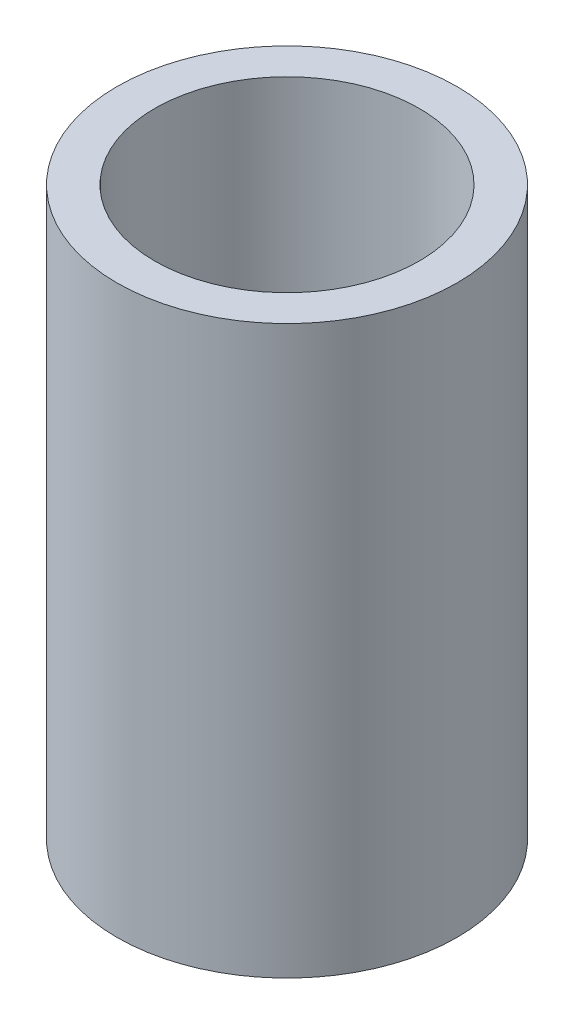
ISO-10303-21;
HEADER;
FILE_DESCRIPTION(('STEP AP214'),'2;1');
FILE_NAME('part.step','',(''),(''),'','','');
FILE_SCHEMA(('AUTOMOTIVE_DESIGN { 1 0 10303 214 1 1 1 1 }'));
ENDSEC;
DATA;
#1=APPLICATION_CONTEXT('core data for automotive mechanical design processes');
#2=APPLICATION_PROTOCOL_DEFINITION('international standard','automotive_design',2000,#1);
#3=PRODUCT_CONTEXT('',#1,'mechanical');
#4=PRODUCT('Part','Part','',(#3));
#5=PRODUCT_RELATED_PRODUCT_CATEGORY('part','',(#4));
#6=PRODUCT_DEFINITION_FORMATION('','',#4);
#7=PRODUCT_DEFINITION_CONTEXT('part definition',#1,'design');
#8=PRODUCT_DEFINITION('design','',#6,#7);
#9=PRODUCT_DEFINITION_SHAPE('','',#8);
#10=(LENGTH_UNIT() NAMED_UNIT(*) SI_UNIT(.MILLI.,.METRE.));
#11=(NAMED_UNIT(*) PLANE_ANGLE_UNIT() SI_UNIT($,.RADIAN.));
#12=(NAMED_UNIT(*) SI_UNIT($,.STERADIAN.) SOLID_ANGLE_UNIT());
#13=UNCERTAINTY_MEASURE_WITH_UNIT(LENGTH_MEASURE(1.E-05),#10,'distance_accuracy_value','');
#14=(GEOMETRIC_REPRESENTATION_CONTEXT(3) GLOBAL_UNCERTAINTY_ASSIGNED_CONTEXT((#13)) GLOBAL_UNIT_ASSIGNED_CONTEXT((#10,
#11,#12)) REPRESENTATION_CONTEXT('',''));
#15=CARTESIAN_POINT('',(0.,0.,0.));
#16=DIRECTION('',(0.,0.,1.));
#17=DIRECTION('',(1.,0.,0.));
#18=AXIS2_PLACEMENT_3D('',#15,#16,#17);
#19=CARTESIAN_POINT('',(0.,95.25,0.));
#20=DIRECTION('',(0.,1.,0.));
#21=DIRECTION('',(0.,0.,1.));
#22=AXIS2_PLACEMENT_3D('',#19,#20,#21);
#23=PLANE('',#22);
#24=CARTESIAN_POINT('',(0.,95.25,0.));
#25=DIRECTION('',(0.,1.,0.));
#26=DIRECTION('',(0.,0.,1.));
#27=AXIS2_PLACEMENT_3D('',#24,#25,#26);
#28=CIRCLE('',#27,28.575);
#29=CARTESIAN_POINT('',(0.,95.25,28.575));
#30=VERTEX_POINT('',#29);
#31=EDGE_CURVE('E10',#30,#30,#28,.T.);
#32=ORIENTED_EDGE('',*,*,#31,.T.);
#33=EDGE_LOOP('',(#32));
#34=FACE_BOUND('',#33,.T.);
#35=CARTESIAN_POINT('',(0.,95.25,0.));
#36=DIRECTION('',(0.,1.,0.));
#37=DIRECTION('',(0.,0.,1.));
#38=AXIS2_PLACEMENT_3D('',#35,#36,#37);
#39=CIRCLE('',#38,22.225);
#40=CARTESIAN_POINT('',(0.,95.25,22.225));
#41=VERTEX_POINT('',#40);
#42=EDGE_CURVE('E57',#41,#41,#39,.T.);
#43=ORIENTED_EDGE('',*,*,#42,.F.);
#44=EDGE_LOOP('',(#43));
#45=FACE_BOUND('',#44,.T.);
#46=ADVANCED_FACE('F43',(#34,#45),#23,.T.);
#47=CARTESIAN_POINT('',(0.,0.,0.));
#48=DIRECTION('',(0.,1.,0.));
#49=DIRECTION('',(0.,0.,1.));
#50=AXIS2_PLACEMENT_3D('',#47,#48,#49);
#51=PLANE('',#50);
#52=CARTESIAN_POINT('',(0.,0.,0.));
#53=DIRECTION('',(0.,1.,0.));
#54=DIRECTION('',(0.,0.,1.));
#55=AXIS2_PLACEMENT_3D('',#52,#53,#54);
#56=CIRCLE('',#55,28.575);
#57=CARTESIAN_POINT('',(0.,0.,28.575));
#58=VERTEX_POINT('',#57);
#59=EDGE_CURVE('E50',#58,#58,#56,.T.);
#60=ORIENTED_EDGE('',*,*,#59,.F.);
#61=EDGE_LOOP('',(#60));
#62=FACE_BOUND('',#61,.T.);
#63=CARTESIAN_POINT('',(0.,0.,0.));
#64=DIRECTION('',(0.,1.,0.));
#65=DIRECTION('',(0.,0.,1.));
#66=AXIS2_PLACEMENT_3D('',#63,#64,#65);
#67=CIRCLE('',#66,22.225);
#68=CARTESIAN_POINT('',(0.,0.,22.225));
#69=VERTEX_POINT('',#68);
#70=EDGE_CURVE('E59',#69,#69,#67,.T.);
#71=ORIENTED_EDGE('',*,*,#70,.T.);
#72=EDGE_LOOP('',(#71));
#73=FACE_BOUND('',#72,.T.);
#74=ADVANCED_FACE('F68',(#62,#73),#51,.F.);
#75=CARTESIAN_POINT('',(0.,95.25,0.));
#76=DIRECTION('',(0.,-1.,0.));
#77=DIRECTION('',(0.,0.,-1.));
#78=AXIS2_PLACEMENT_3D('',#75,#76,#77);
#79=CYLINDRICAL_SURFACE('',#78,28.575);
#80=ORIENTED_EDGE('',*,*,#31,.F.);
#81=EDGE_LOOP('',(#80));
#82=FACE_BOUND('',#81,.T.);
#83=ORIENTED_EDGE('',*,*,#59,.T.);
#84=EDGE_LOOP('',(#83));
#85=FACE_BOUND('',#84,.T.);
#86=ADVANCED_FACE('F44',(#82,#85),#79,.T.);
#87=CARTESIAN_POINT('',(0.,95.25,0.));
#88=DIRECTION('',(0.,-1.,0.));
#89=DIRECTION('',(0.,0.,-1.));
#90=AXIS2_PLACEMENT_3D('',#87,#88,#89);
#91=CYLINDRICAL_SURFACE('',#90,22.225);
#92=ORIENTED_EDGE('',*,*,#42,.T.);
#93=EDGE_LOOP('',(#92));
#94=FACE_BOUND('',#93,.T.);
#95=ORIENTED_EDGE('',*,*,#70,.F.);
#96=EDGE_LOOP('',(#95));
#97=FACE_BOUND('',#96,.T.);
#98=ADVANCED_FACE('F67',(#94,#97),#91,.F.);
#99=CLOSED_SHELL('',(#46,#74,#86,#98));
#100=MANIFOLD_SOLID_BREP('B2',#99);
#101=ADVANCED_BREP_SHAPE_REPRESENTATION('',(#18,#100),#14);
#102=SHAPE_DEFINITION_REPRESENTATION(#9,#101);
ENDSEC;
END-ISO-10303-21;
